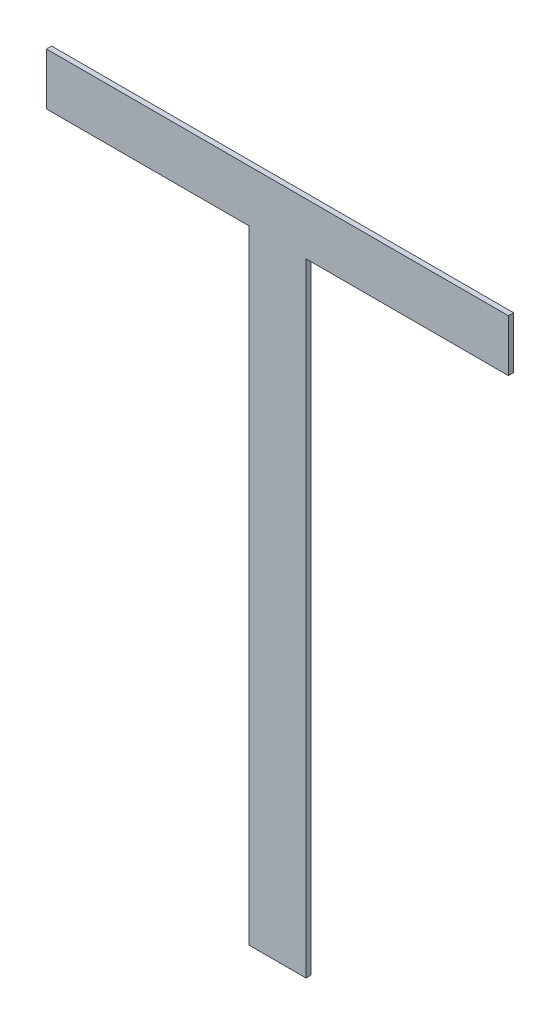
ISO-10303-21;
HEADER;
FILE_DESCRIPTION(('STEP AP214'),'2;1');
FILE_NAME('part.step','',(''),(''),'','','');
FILE_SCHEMA(('AUTOMOTIVE_DESIGN { 1 0 10303 214 1 1 1 1 }'));
ENDSEC;
DATA;
#1=APPLICATION_CONTEXT('core data for automotive mechanical design processes');
#2=APPLICATION_PROTOCOL_DEFINITION('international standard','automotive_design',2000,#1);
#3=PRODUCT_CONTEXT('',#1,'mechanical');
#4=PRODUCT('Part','Part','',(#3));
#5=PRODUCT_RELATED_PRODUCT_CATEGORY('part','',(#4));
#6=PRODUCT_DEFINITION_FORMATION('','',#4);
#7=PRODUCT_DEFINITION_CONTEXT('part definition',#1,'design');
#8=PRODUCT_DEFINITION('design','',#6,#7);
#9=PRODUCT_DEFINITION_SHAPE('','',#8);
#10=(LENGTH_UNIT() NAMED_UNIT(*) SI_UNIT(.MILLI.,.METRE.));
#11=(NAMED_UNIT(*) PLANE_ANGLE_UNIT() SI_UNIT($,.RADIAN.));
#12=(NAMED_UNIT(*) SI_UNIT($,.STERADIAN.) SOLID_ANGLE_UNIT());
#13=UNCERTAINTY_MEASURE_WITH_UNIT(LENGTH_MEASURE(1.E-05),#10,'distance_accuracy_value','');
#14=(GEOMETRIC_REPRESENTATION_CONTEXT(3) GLOBAL_UNCERTAINTY_ASSIGNED_CONTEXT((#13)) GLOBAL_UNIT_ASSIGNED_CONTEXT((#10,
#11,#12)) REPRESENTATION_CONTEXT('',''));
#15=CARTESIAN_POINT('',(0.,0.,0.));
#16=DIRECTION('',(0.,0.,1.));
#17=DIRECTION('',(1.,0.,0.));
#18=AXIS2_PLACEMENT_3D('',#15,#16,#17);
#19=CARTESIAN_POINT('',(-0.44500038,0.65000124,0.01));
#20=DIRECTION('',(0.,0.,1.));
#21=DIRECTION('',(1.,0.,0.));
#22=AXIS2_PLACEMENT_3D('',#19,#20,#21);
#23=PLANE('',#22);
#24=DIRECTION('',(0.,1.,0.));
#25=VECTOR('',#24,1.);
#26=CARTESIAN_POINT('',(0.44500038,0.65000124,0.01));
#27=LINE('',#26,#25);
#28=CARTESIAN_POINT('',(0.44500038,0.65000124,0.01));
#29=VERTEX_POINT('',#28);
#30=CARTESIAN_POINT('',(0.44500038,0.55000144,0.01));
#31=VERTEX_POINT('',#30);
#32=EDGE_CURVE('E117',#29,#31,#27,.F.);
#33=ORIENTED_EDGE('',*,*,#32,.F.);
#34=DIRECTION('',(1.,0.,0.));
#35=VECTOR('',#34,1.);
#36=CARTESIAN_POINT('',(-0.44500038,0.65000124,0.01));
#37=LINE('',#36,#35);
#38=CARTESIAN_POINT('',(-0.44500038,0.65000124,0.01));
#39=VERTEX_POINT('',#38);
#40=EDGE_CURVE('E94',#39,#29,#37,.T.);
#41=ORIENTED_EDGE('',*,*,#40,.F.);
#42=DIRECTION('',(0.,1.,0.));
#43=VECTOR('',#42,1.);
#44=CARTESIAN_POINT('',(-0.44500038,0.55000144,0.01));
#45=LINE('',#44,#43);
#46=CARTESIAN_POINT('',(-0.44500038,0.55000144,0.01));
#47=VERTEX_POINT('',#46);
#48=EDGE_CURVE('E20',#47,#39,#45,.T.);
#49=ORIENTED_EDGE('',*,*,#48,.F.);
#50=DIRECTION('',(1.,0.,0.));
#51=VECTOR('',#50,1.);
#52=CARTESIAN_POINT('',(-0.05500115999999,0.55000144,0.01));
#53=LINE('',#52,#51);
#54=CARTESIAN_POINT('',(-0.05500115999999,0.55000144,0.01));
#55=VERTEX_POINT('',#54);
#56=EDGE_CURVE('E83',#55,#47,#53,.F.);
#57=ORIENTED_EDGE('',*,*,#56,.F.);
#58=DIRECTION('',(0.,1.,0.));
#59=VECTOR('',#58,1.);
#60=CARTESIAN_POINT('',(-0.05500115999999,-0.6499987,0.01));
#61=LINE('',#60,#59);
#62=CARTESIAN_POINT('',(-0.05500115999999,-0.6499987,0.01));
#63=VERTEX_POINT('',#62);
#64=EDGE_CURVE('E78',#63,#55,#61,.T.);
#65=ORIENTED_EDGE('',*,*,#64,.F.);
#66=DIRECTION('',(1.,0.,0.));
#67=VECTOR('',#66,1.);
#68=CARTESIAN_POINT('',(0.05500115999999,-0.6499987,0.01));
#69=LINE('',#68,#67);
#70=CARTESIAN_POINT('',(0.05500115999999,-0.6499987,0.01));
#71=VERTEX_POINT('',#70);
#72=EDGE_CURVE('E105',#71,#63,#69,.F.);
#73=ORIENTED_EDGE('',*,*,#72,.F.);
#74=DIRECTION('',(0.,1.,0.));
#75=VECTOR('',#74,1.);
#76=CARTESIAN_POINT('',(0.05500115999999,0.55000144,0.01));
#77=LINE('',#76,#75);
#78=CARTESIAN_POINT('',(0.05500115999999,0.55000144,0.01));
#79=VERTEX_POINT('',#78);
#80=EDGE_CURVE('E109',#79,#71,#77,.F.);
#81=ORIENTED_EDGE('',*,*,#80,.F.);
#82=DIRECTION('',(1.,0.,0.));
#83=VECTOR('',#82,1.);
#84=CARTESIAN_POINT('',(0.44500038,0.55000144,0.01));
#85=LINE('',#84,#83);
#86=EDGE_CURVE('E113',#31,#79,#85,.F.);
#87=ORIENTED_EDGE('',*,*,#86,.F.);
#88=EDGE_LOOP('',(#33,#41,#49,#57,#65,#73,#81,#87));
#89=FACE_BOUND('',#88,.T.);
#90=ADVANCED_FACE('F17',(#89),#23,.T.);
#91=CARTESIAN_POINT('',(-0.44500038,0.55000144,0.));
#92=DIRECTION('',(-1.,0.,0.));
#93=DIRECTION('',(0.,0.,1.));
#94=AXIS2_PLACEMENT_3D('',#91,#92,#93);
#95=PLANE('',#94);
#96=DIRECTION('',(0.,0.,1.));
#97=VECTOR('',#96,1.);
#98=CARTESIAN_POINT('',(-0.44500038,0.65000124,0.));
#99=LINE('',#98,#97);
#100=CARTESIAN_POINT('',(-0.44500038,0.65000124,0.));
#101=VERTEX_POINT('',#100);
#102=EDGE_CURVE('E121',#101,#39,#99,.T.);
#103=ORIENTED_EDGE('',*,*,#102,.F.);
#104=DIRECTION('',(0.,1.,0.));
#105=VECTOR('',#104,1.);
#106=CARTESIAN_POINT('',(-0.44500038,0.65000124,0.));
#107=LINE('',#106,#105);
#108=CARTESIAN_POINT('',(-0.44500038,0.55000144,0.));
#109=VERTEX_POINT('',#108);
#110=EDGE_CURVE('E100',#101,#109,#107,.F.);
#111=ORIENTED_EDGE('',*,*,#110,.T.);
#112=DIRECTION('',(0.,0.,-1.));
#113=VECTOR('',#112,1.);
#114=CARTESIAN_POINT('',(-0.44500038,0.55000144,0.));
#115=LINE('',#114,#113);
#116=EDGE_CURVE('E88',#47,#109,#115,.T.);
#117=ORIENTED_EDGE('',*,*,#116,.F.);
#118=ORIENTED_EDGE('',*,*,#48,.T.);
#119=EDGE_LOOP('',(#103,#111,#117,#118));
#120=FACE_BOUND('',#119,.T.);
#121=ADVANCED_FACE('F99',(#120),#95,.T.);
#122=CARTESIAN_POINT('',(-0.05500115999999,0.55000144,0.));
#123=DIRECTION('',(0.,-1.,0.));
#124=DIRECTION('',(0.,0.,-1.));
#125=AXIS2_PLACEMENT_3D('',#122,#123,#124);
#126=PLANE('',#125);
#127=ORIENTED_EDGE('',*,*,#116,.T.);
#128=DIRECTION('',(1.,0.,0.));
#129=VECTOR('',#128,1.);
#130=CARTESIAN_POINT('',(-0.44500038,0.55000144,0.));
#131=LINE('',#130,#129);
#132=CARTESIAN_POINT('',(-0.05500115999999,0.55000144,0.));
#133=VERTEX_POINT('',#132);
#134=EDGE_CURVE('E126',#109,#133,#131,.T.);
#135=ORIENTED_EDGE('',*,*,#134,.T.);
#136=DIRECTION('',(0.,0.,1.));
#137=VECTOR('',#136,1.);
#138=CARTESIAN_POINT('',(-0.05500115999999,0.55000144,0.));
#139=LINE('',#138,#137);
#140=EDGE_CURVE('E90',#55,#133,#139,.F.);
#141=ORIENTED_EDGE('',*,*,#140,.F.);
#142=ORIENTED_EDGE('',*,*,#56,.T.);
#143=EDGE_LOOP('',(#127,#135,#141,#142));
#144=FACE_BOUND('',#143,.T.);
#145=ADVANCED_FACE('F85',(#144),#126,.T.);
#146=CARTESIAN_POINT('',(-0.05500115999999,-0.6499987,0.));
#147=DIRECTION('',(-1.,0.,0.));
#148=DIRECTION('',(0.,0.,1.));
#149=AXIS2_PLACEMENT_3D('',#146,#147,#148);
#150=PLANE('',#149);
#151=ORIENTED_EDGE('',*,*,#140,.T.);
#152=DIRECTION('',(0.,1.,0.));
#153=VECTOR('',#152,1.);
#154=CARTESIAN_POINT('',(-0.05500115999999,0.65000124,0.));
#155=LINE('',#154,#153);
#156=CARTESIAN_POINT('',(-0.05500115999999,-0.6499987,0.));
#157=VERTEX_POINT('',#156);
#158=EDGE_CURVE('E128',#133,#157,#155,.F.);
#159=ORIENTED_EDGE('',*,*,#158,.T.);
#160=DIRECTION('',(0.,0.,-1.));
#161=VECTOR('',#160,1.);
#162=CARTESIAN_POINT('',(-0.05500115999999,-0.6499987,0.));
#163=LINE('',#162,#161);
#164=EDGE_CURVE('E107',#63,#157,#163,.T.);
#165=ORIENTED_EDGE('',*,*,#164,.F.);
#166=ORIENTED_EDGE('',*,*,#64,.T.);
#167=EDGE_LOOP('',(#151,#159,#165,#166));
#168=FACE_BOUND('',#167,.T.);
#169=ADVANCED_FACE('F162',(#168),#150,.T.);
#170=CARTESIAN_POINT('',(0.05500115999999,-0.6499987,0.));
#171=DIRECTION('',(0.,-1.,0.));
#172=DIRECTION('',(0.,0.,-1.));
#173=AXIS2_PLACEMENT_3D('',#170,#171,#172);
#174=PLANE('',#173);
#175=ORIENTED_EDGE('',*,*,#164,.T.);
#176=DIRECTION('',(1.,0.,0.));
#177=VECTOR('',#176,1.);
#178=CARTESIAN_POINT('',(-0.44500038,-0.6499987,0.));
#179=LINE('',#178,#177);
#180=CARTESIAN_POINT('',(0.05500115999999,-0.6499987,0.));
#181=VERTEX_POINT('',#180);
#182=EDGE_CURVE('E131',#157,#181,#179,.T.);
#183=ORIENTED_EDGE('',*,*,#182,.T.);
#184=DIRECTION('',(0.,0.,-1.));
#185=VECTOR('',#184,1.);
#186=CARTESIAN_POINT('',(0.05500115999999,-0.6499987,0.));
#187=LINE('',#186,#185);
#188=EDGE_CURVE('E111',#71,#181,#187,.T.);
#189=ORIENTED_EDGE('',*,*,#188,.F.);
#190=ORIENTED_EDGE('',*,*,#72,.T.);
#191=EDGE_LOOP('',(#175,#183,#189,#190));
#192=FACE_BOUND('',#191,.T.);
#193=ADVANCED_FACE('F161',(#192),#174,.T.);
#194=CARTESIAN_POINT('',(0.05500115999999,0.55000144,0.));
#195=DIRECTION('',(1.,0.,0.));
#196=DIRECTION('',(0.,0.,-1.));
#197=AXIS2_PLACEMENT_3D('',#194,#195,#196);
#198=PLANE('',#197);
#199=ORIENTED_EDGE('',*,*,#188,.T.);
#200=DIRECTION('',(0.,1.,0.));
#201=VECTOR('',#200,1.);
#202=CARTESIAN_POINT('',(0.05500115999999,0.65000124,0.));
#203=LINE('',#202,#201);
#204=CARTESIAN_POINT('',(0.05500115999999,0.55000144,0.));
#205=VERTEX_POINT('',#204);
#206=EDGE_CURVE('E134',#181,#205,#203,.T.);
#207=ORIENTED_EDGE('',*,*,#206,.T.);
#208=DIRECTION('',(0.,0.,-1.));
#209=VECTOR('',#208,1.);
#210=CARTESIAN_POINT('',(0.05500115999999,0.55000144,0.));
#211=LINE('',#210,#209);
#212=EDGE_CURVE('E115',#79,#205,#211,.T.);
#213=ORIENTED_EDGE('',*,*,#212,.F.);
#214=ORIENTED_EDGE('',*,*,#80,.T.);
#215=EDGE_LOOP('',(#199,#207,#213,#214));
#216=FACE_BOUND('',#215,.T.);
#217=ADVANCED_FACE('F155',(#216),#198,.T.);
#218=CARTESIAN_POINT('',(0.44500038,0.55000144,0.));
#219=DIRECTION('',(0.,-1.,0.));
#220=DIRECTION('',(0.,0.,-1.));
#221=AXIS2_PLACEMENT_3D('',#218,#219,#220);
#222=PLANE('',#221);
#223=ORIENTED_EDGE('',*,*,#212,.T.);
#224=DIRECTION('',(1.,0.,0.));
#225=VECTOR('',#224,1.);
#226=CARTESIAN_POINT('',(-0.44500038,0.55000144,0.));
#227=LINE('',#226,#225);
#228=CARTESIAN_POINT('',(0.44500038,0.55000144,0.));
#229=VERTEX_POINT('',#228);
#230=EDGE_CURVE('E137',#205,#229,#227,.T.);
#231=ORIENTED_EDGE('',*,*,#230,.T.);
#232=DIRECTION('',(0.,0.,-1.));
#233=VECTOR('',#232,1.);
#234=CARTESIAN_POINT('',(0.44500038,0.55000144,0.));
#235=LINE('',#234,#233);
#236=EDGE_CURVE('E119',#31,#229,#235,.T.);
#237=ORIENTED_EDGE('',*,*,#236,.F.);
#238=ORIENTED_EDGE('',*,*,#86,.T.);
#239=EDGE_LOOP('',(#223,#231,#237,#238));
#240=FACE_BOUND('',#239,.T.);
#241=ADVANCED_FACE('F150',(#240),#222,.T.);
#242=CARTESIAN_POINT('',(0.44500038,0.65000124,0.));
#243=DIRECTION('',(1.,0.,0.));
#244=DIRECTION('',(0.,0.,-1.));
#245=AXIS2_PLACEMENT_3D('',#242,#243,#244);
#246=PLANE('',#245);
#247=ORIENTED_EDGE('',*,*,#236,.T.);
#248=DIRECTION('',(0.,1.,0.));
#249=VECTOR('',#248,1.);
#250=CARTESIAN_POINT('',(0.44500038,0.65000124,0.));
#251=LINE('',#250,#249);
#252=CARTESIAN_POINT('',(0.44500038,0.65000124,0.));
#253=VERTEX_POINT('',#252);
#254=EDGE_CURVE('E26',#229,#253,#251,.T.);
#255=ORIENTED_EDGE('',*,*,#254,.T.);
#256=DIRECTION('',(0.,0.,1.));
#257=VECTOR('',#256,1.);
#258=CARTESIAN_POINT('',(0.44500038,0.65000124,0.));
#259=LINE('',#258,#257);
#260=EDGE_CURVE('E34',#29,#253,#259,.F.);
#261=ORIENTED_EDGE('',*,*,#260,.F.);
#262=ORIENTED_EDGE('',*,*,#32,.T.);
#263=EDGE_LOOP('',(#247,#255,#261,#262));
#264=FACE_BOUND('',#263,.T.);
#265=ADVANCED_FACE('F143',(#264),#246,.T.);
#266=CARTESIAN_POINT('',(-0.44500038,0.65000124,0.));
#267=DIRECTION('',(0.,1.,0.));
#268=DIRECTION('',(0.,0.,1.));
#269=AXIS2_PLACEMENT_3D('',#266,#267,#268);
#270=PLANE('',#269);
#271=ORIENTED_EDGE('',*,*,#260,.T.);
#272=DIRECTION('',(1.,0.,0.));
#273=VECTOR('',#272,1.);
#274=CARTESIAN_POINT('',(-0.44500038,0.65000124,0.));
#275=LINE('',#274,#273);
#276=EDGE_CURVE('E11',#253,#101,#275,.F.);
#277=ORIENTED_EDGE('',*,*,#276,.T.);
#278=ORIENTED_EDGE('',*,*,#102,.T.);
#279=ORIENTED_EDGE('',*,*,#40,.T.);
#280=EDGE_LOOP('',(#271,#277,#278,#279));
#281=FACE_BOUND('',#280,.T.);
#282=ADVANCED_FACE('F163',(#281),#270,.T.);
#283=CARTESIAN_POINT('',(-0.44500038,0.65000124,0.));
#284=DIRECTION('',(0.,0.,1.));
#285=DIRECTION('',(1.,0.,0.));
#286=AXIS2_PLACEMENT_3D('',#283,#284,#285);
#287=PLANE('',#286);
#288=ORIENTED_EDGE('',*,*,#254,.F.);
#289=ORIENTED_EDGE('',*,*,#230,.F.);
#290=ORIENTED_EDGE('',*,*,#206,.F.);
#291=ORIENTED_EDGE('',*,*,#182,.F.);
#292=ORIENTED_EDGE('',*,*,#158,.F.);
#293=ORIENTED_EDGE('',*,*,#134,.F.);
#294=ORIENTED_EDGE('',*,*,#110,.F.);
#295=ORIENTED_EDGE('',*,*,#276,.F.);
#296=EDGE_LOOP('',(#288,#289,#290,#291,#292,#293,#294,#295));
#297=FACE_BOUND('',#296,.T.);
#298=ADVANCED_FACE('F147',(#297),#287,.F.);
#299=CLOSED_SHELL('',(#90,#121,#145,#169,#193,#217,#241,#265,#282,#298));
#300=MANIFOLD_SOLID_BREP('B1',#299);
#301=ADVANCED_BREP_SHAPE_REPRESENTATION('',(#18,#300),#14);
#302=SHAPE_DEFINITION_REPRESENTATION(#9,#301);
ENDSEC;
END-ISO-10303-21;
